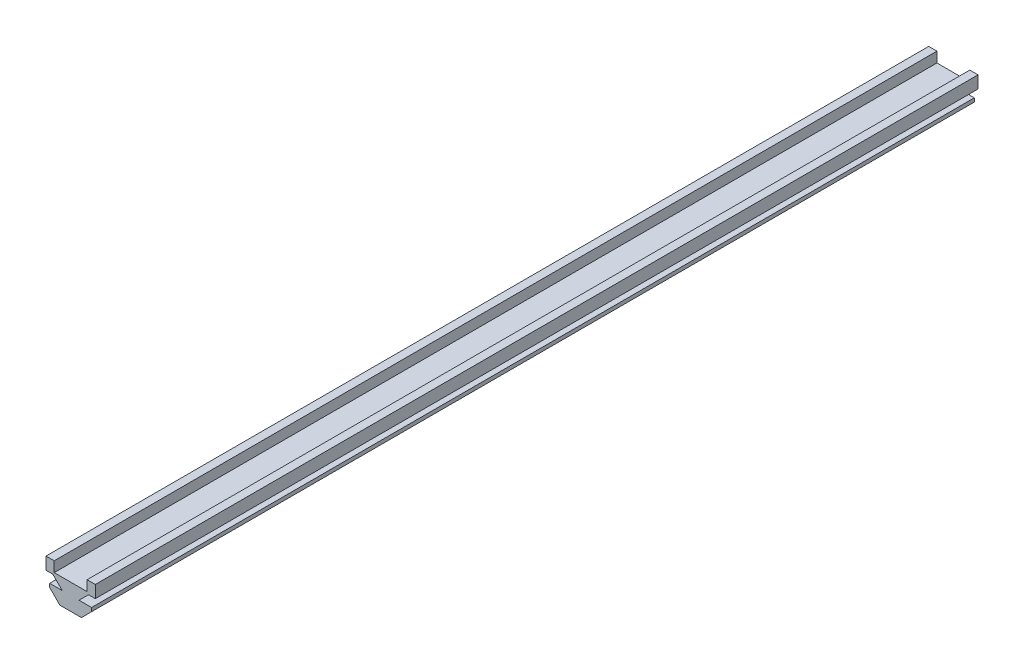
ISO-10303-21;
HEADER;
FILE_DESCRIPTION(('STEP AP214'),'2;1');
FILE_NAME('part.step','',(''),(''),'','','');
FILE_SCHEMA(('AUTOMOTIVE_DESIGN { 1 0 10303 214 1 1 1 1 }'));
ENDSEC;
DATA;
#1=APPLICATION_CONTEXT('core data for automotive mechanical design processes');
#2=APPLICATION_PROTOCOL_DEFINITION('international standard','automotive_design',2000,#1);
#3=PRODUCT_CONTEXT('',#1,'mechanical');
#4=PRODUCT('Part','Part','',(#3));
#5=PRODUCT_RELATED_PRODUCT_CATEGORY('part','',(#4));
#6=PRODUCT_DEFINITION_FORMATION('','',#4);
#7=PRODUCT_DEFINITION_CONTEXT('part definition',#1,'design');
#8=PRODUCT_DEFINITION('design','',#6,#7);
#9=PRODUCT_DEFINITION_SHAPE('','',#8);
#10=(LENGTH_UNIT() NAMED_UNIT(*) SI_UNIT(.MILLI.,.METRE.));
#11=(NAMED_UNIT(*) PLANE_ANGLE_UNIT() SI_UNIT($,.RADIAN.));
#12=(NAMED_UNIT(*) SI_UNIT($,.STERADIAN.) SOLID_ANGLE_UNIT());
#13=UNCERTAINTY_MEASURE_WITH_UNIT(LENGTH_MEASURE(1.E-05),#10,'distance_accuracy_value','');
#14=(GEOMETRIC_REPRESENTATION_CONTEXT(3) GLOBAL_UNCERTAINTY_ASSIGNED_CONTEXT((#13)) GLOBAL_UNIT_ASSIGNED_CONTEXT((#10,
#11,#12)) REPRESENTATION_CONTEXT('',''));
#15=CARTESIAN_POINT('',(0.,0.,0.));
#16=DIRECTION('',(0.,0.,1.));
#17=DIRECTION('',(1.,0.,0.));
#18=AXIS2_PLACEMENT_3D('',#15,#16,#17);
#19=CARTESIAN_POINT('',(4.00000000000002,0.,215.));
#20=DIRECTION('',(-1.,0.,0.));
#21=DIRECTION('',(0.,0.,1.));
#22=AXIS2_PLACEMENT_3D('',#19,#20,#21);
#23=PLANE('',#22);
#24=DIRECTION('',(0.,1.,0.));
#25=VECTOR('',#24,1.);
#26=CARTESIAN_POINT('',(4.00000000000002,0.,0.));
#27=LINE('',#26,#25);
#28=CARTESIAN_POINT('',(4.00000000000002,0.,0.));
#29=VERTEX_POINT('',#28);
#30=CARTESIAN_POINT('',(4.00000000000002,3.00000000000007,0.));
#31=VERTEX_POINT('',#30);
#32=EDGE_CURVE('E201',#29,#31,#27,.T.);
#33=ORIENTED_EDGE('',*,*,#32,.F.);
#34=DIRECTION('',(0.,0.,-1.));
#35=VECTOR('',#34,1.);
#36=CARTESIAN_POINT('',(4.00000000000002,0.,215.));
#37=LINE('',#36,#35);
#38=CARTESIAN_POINT('',(4.00000000000002,0.,215.));
#39=VERTEX_POINT('',#38);
#40=EDGE_CURVE('E11',#39,#29,#37,.T.);
#41=ORIENTED_EDGE('',*,*,#40,.F.);
#42=DIRECTION('',(0.,1.,0.));
#43=VECTOR('',#42,1.);
#44=CARTESIAN_POINT('',(4.00000000000002,0.,215.));
#45=LINE('',#44,#43);
#46=CARTESIAN_POINT('',(4.00000000000002,3.00000000000007,215.));
#47=VERTEX_POINT('',#46);
#48=EDGE_CURVE('E264',#39,#47,#45,.T.);
#49=ORIENTED_EDGE('',*,*,#48,.T.);
#50=DIRECTION('',(0.,0.,-1.));
#51=VECTOR('',#50,1.);
#52=CARTESIAN_POINT('',(4.00000000000002,3.00000000000007,215.));
#53=LINE('',#52,#51);
#54=EDGE_CURVE('E122',#47,#31,#53,.T.);
#55=ORIENTED_EDGE('',*,*,#54,.T.);
#56=EDGE_LOOP('',(#33,#41,#49,#55));
#57=FACE_BOUND('',#56,.T.);
#58=ADVANCED_FACE('F41',(#57),#23,.T.);
#59=CARTESIAN_POINT('',(0.,0.,215.));
#60=DIRECTION('',(0.,-1.,0.));
#61=DIRECTION('',(1.,0.,0.));
#62=AXIS2_PLACEMENT_3D('',#59,#60,#61);
#63=PLANE('',#62);
#64=DIRECTION('',(-1.,0.,0.));
#65=VECTOR('',#64,1.);
#66=CARTESIAN_POINT('',(0.,0.,0.));
#67=LINE('',#66,#65);
#68=CARTESIAN_POINT('',(5.65710678118656,0.,0.));
#69=VERTEX_POINT('',#68);
#70=EDGE_CURVE('E205',#69,#29,#67,.T.);
#71=ORIENTED_EDGE('',*,*,#70,.F.);
#72=DIRECTION('',(0.,0.,-1.));
#73=VECTOR('',#72,1.);
#74=CARTESIAN_POINT('',(5.65710678118656,0.,215.));
#75=LINE('',#74,#73);
#76=CARTESIAN_POINT('',(5.65710678118656,0.,215.));
#77=VERTEX_POINT('',#76);
#78=EDGE_CURVE('E50',#77,#69,#75,.T.);
#79=ORIENTED_EDGE('',*,*,#78,.F.);
#80=DIRECTION('',(-1.,0.,0.));
#81=VECTOR('',#80,1.);
#82=CARTESIAN_POINT('',(0.,0.,215.));
#83=LINE('',#82,#81);
#84=EDGE_CURVE('E332',#77,#39,#83,.T.);
#85=ORIENTED_EDGE('',*,*,#84,.T.);
#86=ORIENTED_EDGE('',*,*,#40,.T.);
#87=EDGE_LOOP('',(#71,#79,#85,#86));
#88=FACE_BOUND('',#87,.T.);
#89=ADVANCED_FACE('F321',(#88),#63,.T.);
#90=CARTESIAN_POINT('',(2.82855339059332,2.82855339059331,215.));
#91=DIRECTION('',(-0.707106781186548,-0.707106781186547,0.));
#92=DIRECTION('',(0.707106781186547,-0.707106781186548,0.));
#93=AXIS2_PLACEMENT_3D('',#90,#91,#92);
#94=PLANE('',#93);
#95=DIRECTION('',(-0.707106781186547,0.707106781186548,0.));
#96=VECTOR('',#95,1.);
#97=CARTESIAN_POINT('',(2.82855339059332,2.82855339059331,0.));
#98=LINE('',#97,#96);
#99=CARTESIAN_POINT('',(7.95710678118658,-2.29999999999996,0.));
#100=VERTEX_POINT('',#99);
#101=EDGE_CURVE('E209',#100,#69,#98,.T.);
#102=ORIENTED_EDGE('',*,*,#101,.F.);
#103=DIRECTION('',(0.,0.,-1.));
#104=VECTOR('',#103,1.);
#105=CARTESIAN_POINT('',(7.95710678118658,-2.29999999999996,215.));
#106=LINE('',#105,#104);
#107=CARTESIAN_POINT('',(7.95710678118658,-2.29999999999996,215.));
#108=VERTEX_POINT('',#107);
#109=EDGE_CURVE('E308',#108,#100,#106,.T.);
#110=ORIENTED_EDGE('',*,*,#109,.F.);
#111=DIRECTION('',(-0.707106781186547,0.707106781186548,0.));
#112=VECTOR('',#111,1.);
#113=CARTESIAN_POINT('',(2.82855339059332,2.82855339059331,215.));
#114=LINE('',#113,#112);
#115=EDGE_CURVE('E317',#108,#77,#114,.T.);
#116=ORIENTED_EDGE('',*,*,#115,.T.);
#117=ORIENTED_EDGE('',*,*,#78,.T.);
#118=EDGE_LOOP('',(#102,#110,#116,#117));
#119=FACE_BOUND('',#118,.T.);
#120=ADVANCED_FACE('F315',(#119),#94,.T.);
#121=CARTESIAN_POINT('',(0.,-2.29999999999996,215.));
#122=DIRECTION('',(0.,1.,0.));
#123=DIRECTION('',(0.,0.,1.));
#124=AXIS2_PLACEMENT_3D('',#121,#122,#123);
#125=PLANE('',#124);
#126=DIRECTION('',(1.,0.,0.));
#127=VECTOR('',#126,1.);
#128=CARTESIAN_POINT('',(0.,-2.29999999999996,0.));
#129=LINE('',#128,#127);
#130=CARTESIAN_POINT('',(4.90000000000005,-2.29999999999996,0.));
#131=VERTEX_POINT('',#130);
#132=EDGE_CURVE('E213',#131,#100,#129,.T.);
#133=ORIENTED_EDGE('',*,*,#132,.F.);
#134=DIRECTION('',(0.,0.,-1.));
#135=VECTOR('',#134,1.);
#136=CARTESIAN_POINT('',(4.90000000000005,-2.29999999999996,215.));
#137=LINE('',#136,#135);
#138=CARTESIAN_POINT('',(4.90000000000005,-2.29999999999996,215.));
#139=VERTEX_POINT('',#138);
#140=EDGE_CURVE('E305',#139,#131,#137,.T.);
#141=ORIENTED_EDGE('',*,*,#140,.F.);
#142=DIRECTION('',(1.,0.,0.));
#143=VECTOR('',#142,1.);
#144=CARTESIAN_POINT('',(0.,-2.29999999999996,215.));
#145=LINE('',#144,#143);
#146=EDGE_CURVE('E331',#139,#108,#145,.T.);
#147=ORIENTED_EDGE('',*,*,#146,.T.);
#148=ORIENTED_EDGE('',*,*,#109,.T.);
#149=EDGE_LOOP('',(#133,#141,#147,#148));
#150=FACE_BOUND('',#149,.T.);
#151=ADVANCED_FACE('F327',(#150),#125,.T.);
#152=CARTESIAN_POINT('',(4.90000000000005,0.,215.));
#153=DIRECTION('',(1.,0.,0.));
#154=DIRECTION('',(0.,0.,-1.));
#155=AXIS2_PLACEMENT_3D('',#152,#153,#154);
#156=PLANE('',#155);
#157=DIRECTION('',(0.,-1.,0.));
#158=VECTOR('',#157,1.);
#159=CARTESIAN_POINT('',(4.90000000000005,0.,0.));
#160=LINE('',#159,#158);
#161=CARTESIAN_POINT('',(4.90000000000005,-3.20294372515229,0.));
#162=VERTEX_POINT('',#161);
#163=EDGE_CURVE('E217',#131,#162,#160,.T.);
#164=ORIENTED_EDGE('',*,*,#163,.T.);
#165=DIRECTION('',(0.,0.,-1.));
#166=VECTOR('',#165,1.);
#167=CARTESIAN_POINT('',(4.90000000000005,-3.20294372515229,215.));
#168=LINE('',#167,#166);
#169=CARTESIAN_POINT('',(4.90000000000005,-3.20294372515229,215.));
#170=VERTEX_POINT('',#169);
#171=EDGE_CURVE('E302',#170,#162,#168,.T.);
#172=ORIENTED_EDGE('',*,*,#171,.F.);
#173=DIRECTION('',(0.,-1.,0.));
#174=VECTOR('',#173,1.);
#175=CARTESIAN_POINT('',(4.90000000000005,0.,215.));
#176=LINE('',#175,#174);
#177=EDGE_CURVE('E337',#139,#170,#176,.T.);
#178=ORIENTED_EDGE('',*,*,#177,.F.);
#179=ORIENTED_EDGE('',*,*,#140,.T.);
#180=EDGE_LOOP('',(#164,#172,#178,#179));
#181=FACE_BOUND('',#180,.T.);
#182=ADVANCED_FACE('F394',(#181),#156,.F.);
#183=CARTESIAN_POINT('',(0.848528137423882,0.848528137423882,215.));
#184=DIRECTION('',(-0.707106781186547,-0.707106781186547,0.));
#185=DIRECTION('',(0.707106781186548,-0.707106781186548,0.));
#186=AXIS2_PLACEMENT_3D('',#183,#184,#185);
#187=PLANE('',#186);
#188=DIRECTION('',(-0.707106781186548,0.707106781186548,0.));
#189=VECTOR('',#188,1.);
#190=CARTESIAN_POINT('',(0.848528137423882,0.848528137423882,0.));
#191=LINE('',#190,#189);
#192=CARTESIAN_POINT('',(7.37205627484774,-5.67499999999998,0.));
#193=VERTEX_POINT('',#192);
#194=EDGE_CURVE('E221',#193,#162,#191,.T.);
#195=ORIENTED_EDGE('',*,*,#194,.F.);
#196=DIRECTION('',(0.,0.,-1.));
#197=VECTOR('',#196,1.);
#198=CARTESIAN_POINT('',(7.37205627484774,-5.67499999999998,215.));
#199=LINE('',#198,#197);
#200=CARTESIAN_POINT('',(7.37205627484774,-5.67499999999998,215.));
#201=VERTEX_POINT('',#200);
#202=EDGE_CURVE('E299',#201,#193,#199,.T.);
#203=ORIENTED_EDGE('',*,*,#202,.F.);
#204=DIRECTION('',(-0.707106781186548,0.707106781186548,0.));
#205=VECTOR('',#204,1.);
#206=CARTESIAN_POINT('',(0.848528137423882,0.848528137423882,215.));
#207=LINE('',#206,#205);
#208=EDGE_CURVE('E344',#201,#170,#207,.T.);
#209=ORIENTED_EDGE('',*,*,#208,.T.);
#210=ORIENTED_EDGE('',*,*,#171,.T.);
#211=EDGE_LOOP('',(#195,#203,#209,#210));
#212=FACE_BOUND('',#211,.T.);
#213=ADVANCED_FACE('F397',(#212),#187,.T.);
#214=CARTESIAN_POINT('',(0.,-5.675,215.));
#215=DIRECTION('',(0.,1.,0.));
#216=DIRECTION('',(-1.,0.,0.));
#217=AXIS2_PLACEMENT_3D('',#214,#215,#216);
#218=PLANE('',#217);
#219=DIRECTION('',(1.,0.,0.));
#220=VECTOR('',#219,1.);
#221=CARTESIAN_POINT('',(0.,-5.675,0.));
#222=LINE('',#221,#220);
#223=CARTESIAN_POINT('',(12.6279437251523,-5.67499999999996,0.));
#224=VERTEX_POINT('',#223);
#225=EDGE_CURVE('E225',#193,#224,#222,.T.);
#226=ORIENTED_EDGE('',*,*,#225,.T.);
#227=DIRECTION('',(0.,0.,-1.));
#228=VECTOR('',#227,1.);
#229=CARTESIAN_POINT('',(12.6279437251523,-5.67499999999996,215.));
#230=LINE('',#229,#228);
#231=CARTESIAN_POINT('',(12.6279437251523,-5.67499999999996,215.));
#232=VERTEX_POINT('',#231);
#233=EDGE_CURVE('E295',#232,#224,#230,.T.);
#234=ORIENTED_EDGE('',*,*,#233,.F.);
#235=DIRECTION('',(1.,0.,0.));
#236=VECTOR('',#235,1.);
#237=CARTESIAN_POINT('',(0.,-5.675,215.));
#238=LINE('',#237,#236);
#239=EDGE_CURVE('E348',#201,#232,#238,.T.);
#240=ORIENTED_EDGE('',*,*,#239,.F.);
#241=ORIENTED_EDGE('',*,*,#202,.T.);
#242=EDGE_LOOP('',(#226,#234,#240,#241));
#243=FACE_BOUND('',#242,.T.);
#244=ADVANCED_FACE('F401',(#243),#218,.F.);
#245=CARTESIAN_POINT('',(9.15147186257619,-9.15147186257612,215.));
#246=DIRECTION('',(-0.707106781186551,0.707106781186545,0.));
#247=DIRECTION('',(-0.707106781186545,-0.707106781186551,0.));
#248=AXIS2_PLACEMENT_3D('',#245,#246,#247);
#249=PLANE('',#248);
#250=DIRECTION('',(0.707106781186545,0.707106781186551,0.));
#251=VECTOR('',#250,1.);
#252=CARTESIAN_POINT('',(9.15147186257619,-9.15147186257612,0.));
#253=LINE('',#252,#251);
#254=CARTESIAN_POINT('',(15.1,-3.20294372515226,0.));
#255=VERTEX_POINT('',#254);
#256=EDGE_CURVE('E228',#224,#255,#253,.T.);
#257=ORIENTED_EDGE('',*,*,#256,.T.);
#258=DIRECTION('',(0.,0.,-1.));
#259=VECTOR('',#258,1.);
#260=CARTESIAN_POINT('',(15.1,-3.20294372515226,215.));
#261=LINE('',#260,#259);
#262=CARTESIAN_POINT('',(15.1,-3.20294372515226,215.));
#263=VERTEX_POINT('',#262);
#264=EDGE_CURVE('E292',#263,#255,#261,.T.);
#265=ORIENTED_EDGE('',*,*,#264,.F.);
#266=DIRECTION('',(0.707106781186545,0.707106781186551,0.));
#267=VECTOR('',#266,1.);
#268=CARTESIAN_POINT('',(9.15147186257619,-9.15147186257612,215.));
#269=LINE('',#268,#267);
#270=EDGE_CURVE('E351',#232,#263,#269,.T.);
#271=ORIENTED_EDGE('',*,*,#270,.F.);
#272=ORIENTED_EDGE('',*,*,#233,.T.);
#273=EDGE_LOOP('',(#257,#265,#271,#272));
#274=FACE_BOUND('',#273,.T.);
#275=ADVANCED_FACE('F405',(#274),#249,.F.);
#276=CARTESIAN_POINT('',(15.1,0.,215.));
#277=DIRECTION('',(1.,0.,0.));
#278=DIRECTION('',(0.,1.,0.));
#279=AXIS2_PLACEMENT_3D('',#276,#277,#278);
#280=PLANE('',#279);
#281=DIRECTION('',(0.,-1.,0.));
#282=VECTOR('',#281,1.);
#283=CARTESIAN_POINT('',(15.1,0.,0.));
#284=LINE('',#283,#282);
#285=CARTESIAN_POINT('',(15.1,-2.29999999999993,0.));
#286=VERTEX_POINT('',#285);
#287=EDGE_CURVE('E232',#286,#255,#284,.T.);
#288=ORIENTED_EDGE('',*,*,#287,.F.);
#289=DIRECTION('',(0.,0.,-1.));
#290=VECTOR('',#289,1.);
#291=CARTESIAN_POINT('',(15.1,-2.29999999999993,215.));
#292=LINE('',#291,#290);
#293=CARTESIAN_POINT('',(15.1,-2.29999999999993,215.));
#294=VERTEX_POINT('',#293);
#295=EDGE_CURVE('E289',#294,#286,#292,.T.);
#296=ORIENTED_EDGE('',*,*,#295,.F.);
#297=DIRECTION('',(0.,-1.,0.));
#298=VECTOR('',#297,1.);
#299=CARTESIAN_POINT('',(15.1,0.,215.));
#300=LINE('',#299,#298);
#301=EDGE_CURVE('E354',#294,#263,#300,.T.);
#302=ORIENTED_EDGE('',*,*,#301,.T.);
#303=ORIENTED_EDGE('',*,*,#264,.T.);
#304=EDGE_LOOP('',(#288,#296,#302,#303));
#305=FACE_BOUND('',#304,.T.);
#306=ADVANCED_FACE('F409',(#305),#280,.T.);
#307=CARTESIAN_POINT('',(0.,-2.3,215.));
#308=DIRECTION('',(0.,-1.,0.));
#309=DIRECTION('',(1.,0.,0.));
#310=AXIS2_PLACEMENT_3D('',#307,#308,#309);
#311=PLANE('',#310);
#312=DIRECTION('',(-1.,0.,0.));
#313=VECTOR('',#312,1.);
#314=CARTESIAN_POINT('',(0.,-2.3,0.));
#315=LINE('',#314,#313);
#316=CARTESIAN_POINT('',(12.0428932188135,-2.29999999999995,0.));
#317=VERTEX_POINT('',#316);
#318=EDGE_CURVE('E236',#286,#317,#315,.T.);
#319=ORIENTED_EDGE('',*,*,#318,.T.);
#320=DIRECTION('',(0.,0.,-1.));
#321=VECTOR('',#320,1.);
#322=CARTESIAN_POINT('',(12.0428932188135,-2.29999999999995,215.));
#323=LINE('',#322,#321);
#324=CARTESIAN_POINT('',(12.0428932188135,-2.29999999999995,215.));
#325=VERTEX_POINT('',#324);
#326=EDGE_CURVE('E285',#325,#317,#323,.T.);
#327=ORIENTED_EDGE('',*,*,#326,.F.);
#328=DIRECTION('',(-1.,0.,0.));
#329=VECTOR('',#328,1.);
#330=CARTESIAN_POINT('',(0.,-2.3,215.));
#331=LINE('',#330,#329);
#332=EDGE_CURVE('E358',#294,#325,#331,.T.);
#333=ORIENTED_EDGE('',*,*,#332,.F.);
#334=ORIENTED_EDGE('',*,*,#295,.T.);
#335=EDGE_LOOP('',(#319,#327,#333,#334));
#336=FACE_BOUND('',#335,.T.);
#337=ADVANCED_FACE('F413',(#336),#311,.F.);
#338=CARTESIAN_POINT('',(7.17144660940677,-7.1714466094067,215.));
#339=DIRECTION('',(-0.707106781186551,0.707106781186544,0.));
#340=DIRECTION('',(-0.707106781186544,-0.707106781186551,0.));
#341=AXIS2_PLACEMENT_3D('',#338,#339,#340);
#342=PLANE('',#341);
#343=DIRECTION('',(0.707106781186544,0.707106781186551,0.));
#344=VECTOR('',#343,1.);
#345=CARTESIAN_POINT('',(7.17144660940677,-7.1714466094067,0.));
#346=LINE('',#345,#344);
#347=CARTESIAN_POINT('',(14.3428932188135,0.,0.));
#348=VERTEX_POINT('',#347);
#349=EDGE_CURVE('E239',#317,#348,#346,.T.);
#350=ORIENTED_EDGE('',*,*,#349,.T.);
#351=DIRECTION('',(0.,0.,-1.));
#352=VECTOR('',#351,1.);
#353=CARTESIAN_POINT('',(14.3428932188135,0.,215.));
#354=LINE('',#353,#352);
#355=CARTESIAN_POINT('',(14.3428932188135,0.,215.));
#356=VERTEX_POINT('',#355);
#357=EDGE_CURVE('E281',#356,#348,#354,.T.);
#358=ORIENTED_EDGE('',*,*,#357,.F.);
#359=DIRECTION('',(0.707106781186544,0.707106781186551,0.));
#360=VECTOR('',#359,1.);
#361=CARTESIAN_POINT('',(7.17144660940677,-7.1714466094067,215.));
#362=LINE('',#361,#360);
#363=EDGE_CURVE('E361',#325,#356,#362,.T.);
#364=ORIENTED_EDGE('',*,*,#363,.F.);
#365=ORIENTED_EDGE('',*,*,#326,.T.);
#366=EDGE_LOOP('',(#350,#358,#364,#365));
#367=FACE_BOUND('',#366,.T.);
#368=ADVANCED_FACE('F417',(#367),#342,.F.);
#369=CARTESIAN_POINT('',(0.,0.,215.));
#370=DIRECTION('',(0.,1.,0.));
#371=DIRECTION('',(-1.,0.,0.));
#372=AXIS2_PLACEMENT_3D('',#369,#370,#371);
#373=PLANE('',#372);
#374=DIRECTION('',(1.,0.,0.));
#375=VECTOR('',#374,1.);
#376=CARTESIAN_POINT('',(0.,0.,0.));
#377=LINE('',#376,#375);
#378=CARTESIAN_POINT('',(16.,0.,0.));
#379=VERTEX_POINT('',#378);
#380=EDGE_CURVE('E242',#348,#379,#377,.T.);
#381=ORIENTED_EDGE('',*,*,#380,.T.);
#382=DIRECTION('',(0.,0.,-1.));
#383=VECTOR('',#382,1.);
#384=CARTESIAN_POINT('',(16.,0.,215.));
#385=LINE('',#384,#383);
#386=CARTESIAN_POINT('',(16.,0.,215.));
#387=VERTEX_POINT('',#386);
#388=EDGE_CURVE('E277',#387,#379,#385,.T.);
#389=ORIENTED_EDGE('',*,*,#388,.F.);
#390=DIRECTION('',(1.,0.,0.));
#391=VECTOR('',#390,1.);
#392=CARTESIAN_POINT('',(0.,0.,215.));
#393=LINE('',#392,#391);
#394=EDGE_CURVE('E364',#356,#387,#393,.T.);
#395=ORIENTED_EDGE('',*,*,#394,.F.);
#396=ORIENTED_EDGE('',*,*,#357,.T.);
#397=EDGE_LOOP('',(#381,#389,#395,#396));
#398=FACE_BOUND('',#397,.T.);
#399=ADVANCED_FACE('F421',(#398),#373,.F.);
#400=CARTESIAN_POINT('',(16.,0.,215.));
#401=DIRECTION('',(-1.,0.,0.));
#402=DIRECTION('',(0.,-1.,0.));
#403=AXIS2_PLACEMENT_3D('',#400,#401,#402);
#404=PLANE('',#403);
#405=DIRECTION('',(0.,1.,0.));
#406=VECTOR('',#405,1.);
#407=CARTESIAN_POINT('',(16.,0.,0.));
#408=LINE('',#407,#406);
#409=CARTESIAN_POINT('',(16.,3.0000000000001,0.));
#410=VERTEX_POINT('',#409);
#411=EDGE_CURVE('E245',#379,#410,#408,.T.);
#412=ORIENTED_EDGE('',*,*,#411,.T.);
#413=DIRECTION('',(0.,0.,-1.));
#414=VECTOR('',#413,1.);
#415=CARTESIAN_POINT('',(16.,3.0000000000001,215.));
#416=LINE('',#415,#414);
#417=CARTESIAN_POINT('',(16.,3.0000000000001,215.));
#418=VERTEX_POINT('',#417);
#419=EDGE_CURVE('E274',#418,#410,#416,.T.);
#420=ORIENTED_EDGE('',*,*,#419,.F.);
#421=DIRECTION('',(0.,1.,0.));
#422=VECTOR('',#421,1.);
#423=CARTESIAN_POINT('',(16.,0.,215.));
#424=LINE('',#423,#422);
#425=EDGE_CURVE('E367',#387,#418,#424,.T.);
#426=ORIENTED_EDGE('',*,*,#425,.F.);
#427=ORIENTED_EDGE('',*,*,#388,.T.);
#428=EDGE_LOOP('',(#412,#420,#426,#427));
#429=FACE_BOUND('',#428,.T.);
#430=ADVANCED_FACE('F425',(#429),#404,.F.);
#431=CARTESIAN_POINT('',(0.,3.00000000000003,215.));
#432=DIRECTION('',(0.,1.,0.));
#433=DIRECTION('',(-1.,0.,0.));
#434=AXIS2_PLACEMENT_3D('',#431,#432,#433);
#435=PLANE('',#434);
#436=DIRECTION('',(1.,0.,0.));
#437=VECTOR('',#436,1.);
#438=CARTESIAN_POINT('',(0.,3.00000000000003,0.));
#439=LINE('',#438,#437);
#440=CARTESIAN_POINT('',(14.,3.00000000000009,0.));
#441=VERTEX_POINT('',#440);
#442=EDGE_CURVE('E249',#441,#410,#439,.T.);
#443=ORIENTED_EDGE('',*,*,#442,.F.);
#444=DIRECTION('',(0.,0.,-1.));
#445=VECTOR('',#444,1.);
#446=CARTESIAN_POINT('',(14.,3.00000000000009,215.));
#447=LINE('',#446,#445);
#448=CARTESIAN_POINT('',(14.,3.00000000000009,215.));
#449=VERTEX_POINT('',#448);
#450=EDGE_CURVE('E271',#449,#441,#447,.T.);
#451=ORIENTED_EDGE('',*,*,#450,.F.);
#452=DIRECTION('',(1.,0.,0.));
#453=VECTOR('',#452,1.);
#454=CARTESIAN_POINT('',(0.,3.00000000000003,215.));
#455=LINE('',#454,#453);
#456=EDGE_CURVE('E195',#449,#418,#455,.T.);
#457=ORIENTED_EDGE('',*,*,#456,.T.);
#458=ORIENTED_EDGE('',*,*,#419,.T.);
#459=EDGE_LOOP('',(#443,#451,#457,#458));
#460=FACE_BOUND('',#459,.T.);
#461=ADVANCED_FACE('F373',(#460),#435,.T.);
#462=CARTESIAN_POINT('',(14.,0.,215.));
#463=DIRECTION('',(-1.,0.,0.));
#464=DIRECTION('',(0.,-1.,0.));
#465=AXIS2_PLACEMENT_3D('',#462,#463,#464);
#466=PLANE('',#465);
#467=DIRECTION('',(0.,1.,0.));
#468=VECTOR('',#467,1.);
#469=CARTESIAN_POINT('',(14.,0.,0.));
#470=LINE('',#469,#468);
#471=CARTESIAN_POINT('',(14.,0.50000000000006,0.));
#472=VERTEX_POINT('',#471);
#473=EDGE_CURVE('E253',#472,#441,#470,.T.);
#474=ORIENTED_EDGE('',*,*,#473,.F.);
#475=DIRECTION('',(0.,0.,-1.));
#476=VECTOR('',#475,1.);
#477=CARTESIAN_POINT('',(14.,0.50000000000006,215.));
#478=LINE('',#477,#476);
#479=CARTESIAN_POINT('',(14.,0.50000000000006,215.));
#480=VERTEX_POINT('',#479);
#481=EDGE_CURVE('E180',#480,#472,#478,.T.);
#482=ORIENTED_EDGE('',*,*,#481,.F.);
#483=DIRECTION('',(0.,1.,0.));
#484=VECTOR('',#483,1.);
#485=CARTESIAN_POINT('',(14.,0.,215.));
#486=LINE('',#485,#484);
#487=EDGE_CURVE('E191',#480,#449,#486,.T.);
#488=ORIENTED_EDGE('',*,*,#487,.T.);
#489=ORIENTED_EDGE('',*,*,#450,.T.);
#490=EDGE_LOOP('',(#474,#482,#488,#489));
#491=FACE_BOUND('',#490,.T.);
#492=ADVANCED_FACE('F378',(#491),#466,.T.);
#493=CARTESIAN_POINT('',(0.,0.500000000000027,215.));
#494=DIRECTION('',(0.,1.,0.));
#495=DIRECTION('',(-1.,0.,0.));
#496=AXIS2_PLACEMENT_3D('',#493,#494,#495);
#497=PLANE('',#496);
#498=DIRECTION('',(1.,0.,0.));
#499=VECTOR('',#498,1.);
#500=CARTESIAN_POINT('',(0.,0.500000000000027,0.));
#501=LINE('',#500,#499);
#502=CARTESIAN_POINT('',(6.00000000000003,0.500000000000041,0.));
#503=VERTEX_POINT('',#502);
#504=EDGE_CURVE('E178',#503,#472,#501,.T.);
#505=ORIENTED_EDGE('',*,*,#504,.F.);
#506=DIRECTION('',(0.,0.,-1.));
#507=VECTOR('',#506,1.);
#508=CARTESIAN_POINT('',(6.00000000000003,0.500000000000041,215.));
#509=LINE('',#508,#507);
#510=CARTESIAN_POINT('',(6.00000000000003,0.500000000000041,215.));
#511=VERTEX_POINT('',#510);
#512=EDGE_CURVE('E172',#511,#503,#509,.T.);
#513=ORIENTED_EDGE('',*,*,#512,.F.);
#514=DIRECTION('',(1.,0.,0.));
#515=VECTOR('',#514,1.);
#516=CARTESIAN_POINT('',(0.,0.500000000000027,215.));
#517=LINE('',#516,#515);
#518=EDGE_CURVE('E176',#511,#480,#517,.T.);
#519=ORIENTED_EDGE('',*,*,#518,.T.);
#520=ORIENTED_EDGE('',*,*,#481,.T.);
#521=EDGE_LOOP('',(#505,#513,#519,#520));
#522=FACE_BOUND('',#521,.T.);
#523=ADVANCED_FACE('F174',(#522),#497,.T.);
#524=CARTESIAN_POINT('',(6.00000000000004,0.,215.));
#525=DIRECTION('',(-1.,0.,0.));
#526=DIRECTION('',(0.,-1.,0.));
#527=AXIS2_PLACEMENT_3D('',#524,#525,#526);
#528=PLANE('',#527);
#529=DIRECTION('',(0.,1.,0.));
#530=VECTOR('',#529,1.);
#531=CARTESIAN_POINT('',(6.00000000000004,0.,0.));
#532=LINE('',#531,#530);
#533=CARTESIAN_POINT('',(6.00000000000002,3.00000000000007,0.));
#534=VERTEX_POINT('',#533);
#535=EDGE_CURVE('E115',#503,#534,#532,.T.);
#536=ORIENTED_EDGE('',*,*,#535,.T.);
#537=DIRECTION('',(0.,0.,-1.));
#538=VECTOR('',#537,1.);
#539=CARTESIAN_POINT('',(6.00000000000002,3.00000000000007,215.));
#540=LINE('',#539,#538);
#541=CARTESIAN_POINT('',(6.00000000000002,3.00000000000007,215.));
#542=VERTEX_POINT('',#541);
#543=EDGE_CURVE('E181',#542,#534,#540,.T.);
#544=ORIENTED_EDGE('',*,*,#543,.F.);
#545=DIRECTION('',(0.,1.,0.));
#546=VECTOR('',#545,1.);
#547=CARTESIAN_POINT('',(6.00000000000004,0.,215.));
#548=LINE('',#547,#546);
#549=EDGE_CURVE('E183',#511,#542,#548,.T.);
#550=ORIENTED_EDGE('',*,*,#549,.F.);
#551=ORIENTED_EDGE('',*,*,#512,.T.);
#552=EDGE_LOOP('',(#536,#544,#550,#551));
#553=FACE_BOUND('',#552,.T.);
#554=ADVANCED_FACE('F184',(#553),#528,.F.);
#555=CARTESIAN_POINT('',(0.,3.00000000000007,215.));
#556=DIRECTION('',(0.,-1.,0.));
#557=DIRECTION('',(1.,0.,0.));
#558=AXIS2_PLACEMENT_3D('',#555,#556,#557);
#559=PLANE('',#558);
#560=DIRECTION('',(-1.,0.,0.));
#561=VECTOR('',#560,1.);
#562=CARTESIAN_POINT('',(0.,3.00000000000007,0.));
#563=LINE('',#562,#561);
#564=EDGE_CURVE('E261',#534,#31,#563,.T.);
#565=ORIENTED_EDGE('',*,*,#564,.T.);
#566=ORIENTED_EDGE('',*,*,#54,.F.);
#567=DIRECTION('',(-1.,0.,0.));
#568=VECTOR('',#567,1.);
#569=CARTESIAN_POINT('',(0.,3.00000000000007,215.));
#570=LINE('',#569,#568);
#571=EDGE_CURVE('E58',#542,#47,#570,.T.);
#572=ORIENTED_EDGE('',*,*,#571,.F.);
#573=ORIENTED_EDGE('',*,*,#543,.T.);
#574=EDGE_LOOP('',(#565,#566,#572,#573));
#575=FACE_BOUND('',#574,.T.);
#576=ADVANCED_FACE('F381',(#575),#559,.F.);
#577=CARTESIAN_POINT('',(0.,0.,215.));
#578=DIRECTION('',(0.,0.,1.));
#579=DIRECTION('',(1.,0.,0.));
#580=AXIS2_PLACEMENT_3D('',#577,#578,#579);
#581=PLANE('',#580);
#582=ORIENTED_EDGE('',*,*,#48,.F.);
#583=ORIENTED_EDGE('',*,*,#84,.F.);
#584=ORIENTED_EDGE('',*,*,#115,.F.);
#585=ORIENTED_EDGE('',*,*,#146,.F.);
#586=ORIENTED_EDGE('',*,*,#177,.T.);
#587=ORIENTED_EDGE('',*,*,#208,.F.);
#588=ORIENTED_EDGE('',*,*,#239,.T.);
#589=ORIENTED_EDGE('',*,*,#270,.T.);
#590=ORIENTED_EDGE('',*,*,#301,.F.);
#591=ORIENTED_EDGE('',*,*,#332,.T.);
#592=ORIENTED_EDGE('',*,*,#363,.T.);
#593=ORIENTED_EDGE('',*,*,#394,.T.);
#594=ORIENTED_EDGE('',*,*,#425,.T.);
#595=ORIENTED_EDGE('',*,*,#456,.F.);
#596=ORIENTED_EDGE('',*,*,#487,.F.);
#597=ORIENTED_EDGE('',*,*,#518,.F.);
#598=ORIENTED_EDGE('',*,*,#549,.T.);
#599=ORIENTED_EDGE('',*,*,#571,.T.);
#600=EDGE_LOOP('',(#582,#583,#584,#585,#586,#587,#588,#589,#590,#591,#592,#593,#594,#595,#596,
#597,#598,#599));
#601=FACE_BOUND('',#600,.T.);
#602=ADVANCED_FACE('F188',(#601),#581,.T.);
#603=CARTESIAN_POINT('',(0.,0.,0.));
#604=DIRECTION('',(0.,0.,1.));
#605=DIRECTION('',(1.,0.,0.));
#606=AXIS2_PLACEMENT_3D('',#603,#604,#605);
#607=PLANE('',#606);
#608=ORIENTED_EDGE('',*,*,#32,.T.);
#609=ORIENTED_EDGE('',*,*,#564,.F.);
#610=ORIENTED_EDGE('',*,*,#535,.F.);
#611=ORIENTED_EDGE('',*,*,#504,.T.);
#612=ORIENTED_EDGE('',*,*,#473,.T.);
#613=ORIENTED_EDGE('',*,*,#442,.T.);
#614=ORIENTED_EDGE('',*,*,#411,.F.);
#615=ORIENTED_EDGE('',*,*,#380,.F.);
#616=ORIENTED_EDGE('',*,*,#349,.F.);
#617=ORIENTED_EDGE('',*,*,#318,.F.);
#618=ORIENTED_EDGE('',*,*,#287,.T.);
#619=ORIENTED_EDGE('',*,*,#256,.F.);
#620=ORIENTED_EDGE('',*,*,#225,.F.);
#621=ORIENTED_EDGE('',*,*,#194,.T.);
#622=ORIENTED_EDGE('',*,*,#163,.F.);
#623=ORIENTED_EDGE('',*,*,#132,.T.);
#624=ORIENTED_EDGE('',*,*,#101,.T.);
#625=ORIENTED_EDGE('',*,*,#70,.T.);
#626=EDGE_LOOP('',(#608,#609,#610,#611,#612,#613,#614,#615,#616,#617,#618,#619,#620,#621,#622,
#623,#624,#625));
#627=FACE_BOUND('',#626,.T.);
#628=ADVANCED_FACE('F323',(#627),#607,.F.);
#629=CLOSED_SHELL('',(#58,#89,#120,#151,#182,#213,#244,#275,#306,#337,#368,#399,#430,#461,#492,
#523,#554,#576,#602,#628));
#630=MANIFOLD_SOLID_BREP('B2',#629);
#631=ADVANCED_BREP_SHAPE_REPRESENTATION('',(#18,#630),#14);
#632=SHAPE_DEFINITION_REPRESENTATION(#9,#631);
ENDSEC;
END-ISO-10303-21;
